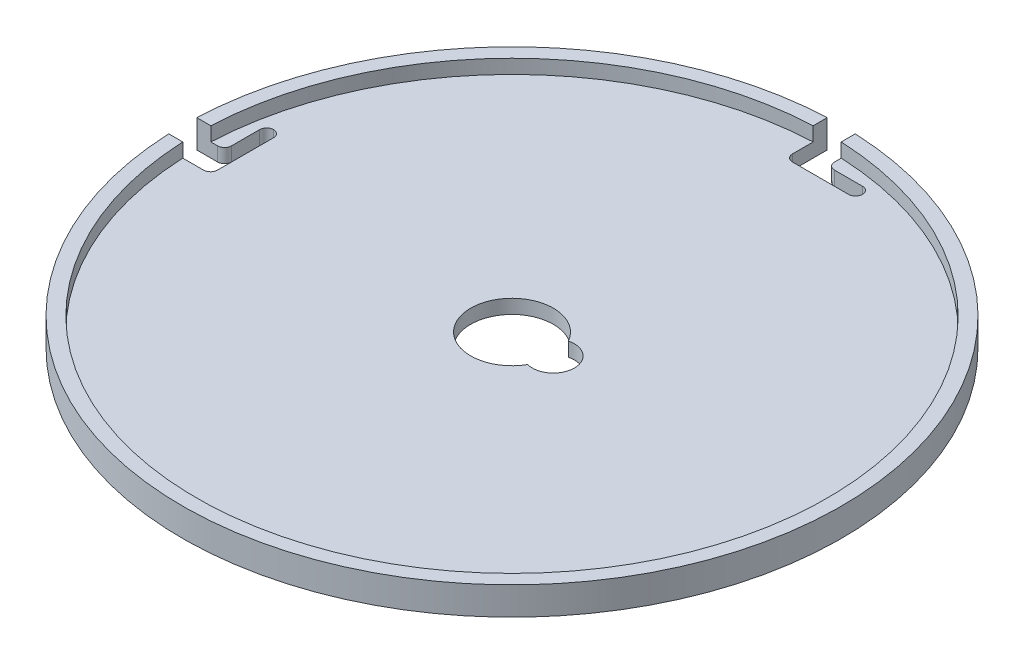
ISO-10303-21;
HEADER;
FILE_DESCRIPTION(('STEP AP214'),'2;1');
FILE_NAME('part.step','',(''),(''),'','','');
FILE_SCHEMA(('AUTOMOTIVE_DESIGN { 1 0 10303 214 1 1 1 1 }'));
ENDSEC;
DATA;
#1=APPLICATION_CONTEXT('core data for automotive mechanical design processes');
#2=APPLICATION_PROTOCOL_DEFINITION('international standard','automotive_design',2000,#1);
#3=PRODUCT_CONTEXT('',#1,'mechanical');
#4=PRODUCT('Part','Part','',(#3));
#5=PRODUCT_RELATED_PRODUCT_CATEGORY('part','',(#4));
#6=PRODUCT_DEFINITION_FORMATION('','',#4);
#7=PRODUCT_DEFINITION_CONTEXT('part definition',#1,'design');
#8=PRODUCT_DEFINITION('design','',#6,#7);
#9=PRODUCT_DEFINITION_SHAPE('','',#8);
#10=(LENGTH_UNIT() NAMED_UNIT(*) SI_UNIT(.MILLI.,.METRE.));
#11=(NAMED_UNIT(*) PLANE_ANGLE_UNIT() SI_UNIT($,.RADIAN.));
#12=(NAMED_UNIT(*) SI_UNIT($,.STERADIAN.) SOLID_ANGLE_UNIT());
#13=UNCERTAINTY_MEASURE_WITH_UNIT(LENGTH_MEASURE(1.E-05),#10,'distance_accuracy_value','');
#14=(GEOMETRIC_REPRESENTATION_CONTEXT(3) GLOBAL_UNCERTAINTY_ASSIGNED_CONTEXT((#13)) GLOBAL_UNIT_ASSIGNED_CONTEXT((#10,
#11,#12)) REPRESENTATION_CONTEXT('',''));
#15=CARTESIAN_POINT('',(0.,0.,0.));
#16=DIRECTION('',(0.,0.,1.));
#17=DIRECTION('',(1.,0.,0.));
#18=AXIS2_PLACEMENT_3D('',#15,#16,#17);
#19=CARTESIAN_POINT('',(0.,2.,0.));
#20=DIRECTION('',(0.,-1.,0.));
#21=DIRECTION('',(0.,0.,-1.));
#22=AXIS2_PLACEMENT_3D('',#19,#20,#21);
#23=CYLINDRICAL_SURFACE('',#22,47.);
#24=DIRECTION('',(0.,-1.,0.));
#25=VECTOR('',#24,1.);
#26=CARTESIAN_POINT('',(-46.9574275274956,2.,-1.99999999999984));
#27=LINE('',#26,#25);
#28=CARTESIAN_POINT('',(-46.9574275274956,2.,-1.99999999999984));
#29=VERTEX_POINT('',#28);
#30=CARTESIAN_POINT('',(-46.9574275274956,-2.,-1.99999999999984));
#31=VERTEX_POINT('',#30);
#32=EDGE_CURVE('E263',#29,#31,#27,.T.);
#33=ORIENTED_EDGE('',*,*,#32,.F.);
#34=CARTESIAN_POINT('',(0.,2.,0.));
#35=DIRECTION('',(0.,1.,0.));
#36=DIRECTION('',(0.,0.,1.));
#37=AXIS2_PLACEMENT_3D('',#34,#35,#36);
#38=CIRCLE('',#37,47.);
#39=CARTESIAN_POINT('',(-2.,2.,-46.9574275274956));
#40=VERTEX_POINT('',#39);
#41=EDGE_CURVE('E326',#40,#29,#38,.T.);
#42=ORIENTED_EDGE('',*,*,#41,.F.);
#43=DIRECTION('',(0.,-1.,0.));
#44=VECTOR('',#43,1.);
#45=CARTESIAN_POINT('',(-2.,2.,-46.9574275274956));
#46=LINE('',#45,#44);
#47=CARTESIAN_POINT('',(-2.,-2.,-46.9574275274956));
#48=VERTEX_POINT('',#47);
#49=EDGE_CURVE('E306',#40,#48,#46,.T.);
#50=ORIENTED_EDGE('',*,*,#49,.T.);
#51=CARTESIAN_POINT('',(0.,-2.,0.));
#52=DIRECTION('',(0.,1.,0.));
#53=DIRECTION('',(0.,0.,1.));
#54=AXIS2_PLACEMENT_3D('',#51,#52,#53);
#55=CIRCLE('',#54,47.);
#56=EDGE_CURVE('E321',#48,#31,#55,.T.);
#57=ORIENTED_EDGE('',*,*,#56,.T.);
#58=EDGE_LOOP('',(#33,#42,#50,#57));
#59=FACE_BOUND('',#58,.T.);
#60=ADVANCED_FACE('F45',(#59),#23,.T.);
#61=CARTESIAN_POINT('',(0.,2.,0.));
#62=DIRECTION('',(0.,1.,0.));
#63=DIRECTION('',(0.,0.,1.));
#64=AXIS2_PLACEMENT_3D('',#61,#62,#63);
#65=PLANE('',#64);
#66=ORIENTED_EDGE('',*,*,#41,.T.);
#67=DIRECTION('',(1.,0.,0.));
#68=VECTOR('',#67,1.);
#69=CARTESIAN_POINT('',(-47.,2.,-1.99999999999984));
#70=LINE('',#69,#68);
#71=CARTESIAN_POINT('',(-44.9555335859781,2.,-1.99999999999984));
#72=VERTEX_POINT('',#71);
#73=EDGE_CURVE('E239',#29,#72,#70,.T.);
#74=ORIENTED_EDGE('',*,*,#73,.T.);
#75=CARTESIAN_POINT('',(0.,2.,0.));
#76=DIRECTION('',(0.,1.,0.));
#77=DIRECTION('',(0.,0.,1.));
#78=AXIS2_PLACEMENT_3D('',#75,#76,#77);
#79=CIRCLE('',#78,45.);
#80=CARTESIAN_POINT('',(-2.,2.,-44.9555335859781));
#81=VERTEX_POINT('',#80);
#82=EDGE_CURVE('E311',#81,#72,#79,.T.);
#83=ORIENTED_EDGE('',*,*,#82,.F.);
#84=DIRECTION('',(0.,0.,1.));
#85=VECTOR('',#84,1.);
#86=CARTESIAN_POINT('',(-2.,2.,-47.));
#87=LINE('',#86,#85);
#88=EDGE_CURVE('E273',#40,#81,#87,.T.);
#89=ORIENTED_EDGE('',*,*,#88,.F.);
#90=EDGE_LOOP('',(#66,#74,#83,#89));
#91=FACE_BOUND('',#90,.T.);
#92=ADVANCED_FACE('F513',(#91),#65,.T.);
#93=CARTESIAN_POINT('',(0.,2.,0.));
#94=DIRECTION('',(0.,-1.,0.));
#95=DIRECTION('',(0.,0.,-1.));
#96=AXIS2_PLACEMENT_3D('',#93,#94,#95);
#97=CYLINDRICAL_SURFACE('',#96,45.);
#98=ORIENTED_EDGE('',*,*,#82,.T.);
#99=DIRECTION('',(0.,-1.,0.));
#100=VECTOR('',#99,1.);
#101=CARTESIAN_POINT('',(-44.9555335859781,2.,-1.99999999999984));
#102=LINE('',#101,#100);
#103=CARTESIAN_POINT('',(-44.9555335859781,0.,-1.99999999999984));
#104=VERTEX_POINT('',#103);
#105=EDGE_CURVE('E259',#72,#104,#102,.T.);
#106=ORIENTED_EDGE('',*,*,#105,.T.);
#107=CARTESIAN_POINT('',(0.,0.,0.));
#108=DIRECTION('',(0.,1.,0.));
#109=DIRECTION('',(0.,0.,1.));
#110=AXIS2_PLACEMENT_3D('',#107,#108,#109);
#111=CIRCLE('',#110,45.);
#112=CARTESIAN_POINT('',(-2.,0.,-44.9555335859781));
#113=VERTEX_POINT('',#112);
#114=EDGE_CURVE('E317',#113,#104,#111,.T.);
#115=ORIENTED_EDGE('',*,*,#114,.F.);
#116=DIRECTION('',(0.,-1.,0.));
#117=VECTOR('',#116,1.);
#118=CARTESIAN_POINT('',(-2.,2.,-44.9555335859781));
#119=LINE('',#118,#117);
#120=EDGE_CURVE('E303',#81,#113,#119,.T.);
#121=ORIENTED_EDGE('',*,*,#120,.F.);
#122=EDGE_LOOP('',(#98,#106,#115,#121));
#123=FACE_BOUND('',#122,.T.);
#124=ADVANCED_FACE('F511',(#123),#97,.F.);
#125=CARTESIAN_POINT('',(-46.9574275274956,2.,2.00000000000016));
#126=VERTEX_POINT('',#125);
#127=CARTESIAN_POINT('',(2.,2.,-46.9574275274956));
#128=VERTEX_POINT('',#127);
#129=EDGE_CURVE('E325',#126,#128,#38,.T.);
#130=ORIENTED_EDGE('',*,*,#129,.F.);
#131=DIRECTION('',(0.,-1.,0.));
#132=VECTOR('',#131,1.);
#133=CARTESIAN_POINT('',(-46.9574275274956,2.,2.00000000000016));
#134=LINE('',#133,#132);
#135=CARTESIAN_POINT('',(-46.9574275274956,-2.,2.00000000000016));
#136=VERTEX_POINT('',#135);
#137=EDGE_CURVE('E269',#126,#136,#134,.T.);
#138=ORIENTED_EDGE('',*,*,#137,.T.);
#139=CARTESIAN_POINT('',(2.,-2.,-46.9574275274956));
#140=VERTEX_POINT('',#139);
#141=EDGE_CURVE('E315',#136,#140,#55,.T.);
#142=ORIENTED_EDGE('',*,*,#141,.T.);
#143=DIRECTION('',(0.,-1.,0.));
#144=VECTOR('',#143,1.);
#145=CARTESIAN_POINT('',(2.,2.,-46.9574275274956));
#146=LINE('',#145,#144);
#147=EDGE_CURVE('E299',#128,#140,#146,.T.);
#148=ORIENTED_EDGE('',*,*,#147,.F.);
#149=EDGE_LOOP('',(#130,#138,#142,#148));
#150=FACE_BOUND('',#149,.T.);
#151=ADVANCED_FACE('F474',(#150),#23,.T.);
#152=DIRECTION('',(1.,0.,0.));
#153=VECTOR('',#152,1.);
#154=CARTESIAN_POINT('',(-47.,2.,2.00000000000016));
#155=LINE('',#154,#153);
#156=CARTESIAN_POINT('',(-44.955533585978,2.,2.00000000000016));
#157=VERTEX_POINT('',#156);
#158=EDGE_CURVE('E235',#126,#157,#155,.T.);
#159=ORIENTED_EDGE('',*,*,#158,.F.);
#160=ORIENTED_EDGE('',*,*,#129,.T.);
#161=DIRECTION('',(0.,0.,1.));
#162=VECTOR('',#161,1.);
#163=CARTESIAN_POINT('',(2.,2.,-47.));
#164=LINE('',#163,#162);
#165=CARTESIAN_POINT('',(2.,2.,-44.9555335859781));
#166=VERTEX_POINT('',#165);
#167=EDGE_CURVE('E276',#128,#166,#164,.T.);
#168=ORIENTED_EDGE('',*,*,#167,.T.);
#169=EDGE_CURVE('E316',#157,#166,#79,.T.);
#170=ORIENTED_EDGE('',*,*,#169,.F.);
#171=EDGE_LOOP('',(#159,#160,#168,#170));
#172=FACE_BOUND('',#171,.T.);
#173=ADVANCED_FACE('F469',(#172),#65,.T.);
#174=CARTESIAN_POINT('',(0.,-2.,0.));
#175=DIRECTION('',(0.,1.,0.));
#176=DIRECTION('',(0.,0.,1.));
#177=AXIS2_PLACEMENT_3D('',#174,#175,#176);
#178=PLANE('',#177);
#179=CARTESIAN_POINT('',(5.9,-2.,0.));
#180=DIRECTION('',(0.,1.,0.));
#181=DIRECTION('',(0.,0.,1.));
#182=AXIS2_PLACEMENT_3D('',#179,#180,#181);
#183=CIRCLE('',#182,3.);
#184=CARTESIAN_POINT('',(5.13728813559322,-2.,2.9014256171567));
#185=VERTEX_POINT('',#184);
#186=CARTESIAN_POINT('',(5.13728813559322,-2.,-2.9014256171567));
#187=VERTEX_POINT('',#186);
#188=EDGE_CURVE('E220',#185,#187,#183,.T.);
#189=ORIENTED_EDGE('',*,*,#188,.T.);
#190=CARTESIAN_POINT('',(0.,-2.,0.));
#191=DIRECTION('',(0.,1.,0.));
#192=DIRECTION('',(0.,0.,1.));
#193=AXIS2_PLACEMENT_3D('',#190,#191,#192);
#194=CIRCLE('',#193,5.9);
#195=EDGE_CURVE('E212',#187,#185,#194,.T.);
#196=ORIENTED_EDGE('',*,*,#195,.T.);
#197=EDGE_LOOP('',(#189,#196));
#198=FACE_BOUND('',#197,.T.);
#199=DIRECTION('',(0.,0.,-1.));
#200=VECTOR('',#199,1.);
#201=CARTESIAN_POINT('',(-43.,-2.,-1.99999999999985));
#202=LINE('',#201,#200);
#203=CARTESIAN_POINT('',(-43.,-2.,-2.99999999999985));
#204=VERTEX_POINT('',#203);
#205=CARTESIAN_POINT('',(-43.,-2.,-6.99999999999985));
#206=VERTEX_POINT('',#205);
#207=EDGE_CURVE('E243',#204,#206,#202,.T.);
#208=ORIENTED_EDGE('',*,*,#207,.F.);
#209=CARTESIAN_POINT('',(-44.,-2.,-2.99999999999985));
#210=DIRECTION('',(0.,1.,0.));
#211=DIRECTION('',(0.,0.,1.));
#212=AXIS2_PLACEMENT_3D('',#209,#210,#211);
#213=CIRCLE('',#212,1.);
#214=CARTESIAN_POINT('',(-44.,-2.,-1.99999999999985));
#215=VERTEX_POINT('',#214);
#216=EDGE_CURVE('E396',#204,#215,#213,.F.);
#217=ORIENTED_EDGE('',*,*,#216,.T.);
#218=DIRECTION('',(1.,0.,0.));
#219=VECTOR('',#218,1.);
#220=CARTESIAN_POINT('',(-47.,-2.,-1.99999999999984));
#221=LINE('',#220,#219);
#222=EDGE_CURVE('E255',#31,#215,#221,.T.);
#223=ORIENTED_EDGE('',*,*,#222,.F.);
#224=ORIENTED_EDGE('',*,*,#56,.F.);
#225=DIRECTION('',(0.,0.,1.));
#226=VECTOR('',#225,1.);
#227=CARTESIAN_POINT('',(-2.,-2.,-47.));
#228=LINE('',#227,#226);
#229=CARTESIAN_POINT('',(-2.,-2.,-42.));
#230=VERTEX_POINT('',#229);
#231=EDGE_CURVE('E287',#48,#230,#228,.T.);
#232=ORIENTED_EDGE('',*,*,#231,.T.);
#233=CARTESIAN_POINT('',(-0.999999999999999,-2.,-42.));
#234=DIRECTION('',(0.,1.,0.));
#235=DIRECTION('',(0.,0.,1.));
#236=AXIS2_PLACEMENT_3D('',#233,#234,#235);
#237=CIRCLE('',#236,1.);
#238=CARTESIAN_POINT('',(-0.999999999999999,-2.,-41.));
#239=VERTEX_POINT('',#238);
#240=EDGE_CURVE('E446',#230,#239,#237,.T.);
#241=ORIENTED_EDGE('',*,*,#240,.T.);
#242=DIRECTION('',(1.,0.,0.));
#243=VECTOR('',#242,1.);
#244=CARTESIAN_POINT('',(-2.,-2.,-41.));
#245=LINE('',#244,#243);
#246=CARTESIAN_POINT('',(7.,-2.,-41.));
#247=VERTEX_POINT('',#246);
#248=EDGE_CURVE('E284',#239,#247,#245,.T.);
#249=ORIENTED_EDGE('',*,*,#248,.T.);
#250=CARTESIAN_POINT('',(7.,-2.,-42.));
#251=DIRECTION('',(0.,1.,0.));
#252=DIRECTION('',(0.,0.,1.));
#253=AXIS2_PLACEMENT_3D('',#250,#251,#252);
#254=CIRCLE('',#253,1.);
#255=CARTESIAN_POINT('',(8.,-2.,-42.));
#256=VERTEX_POINT('',#255);
#257=EDGE_CURVE('E62',#247,#256,#254,.T.);
#258=ORIENTED_EDGE('',*,*,#257,.T.);
#259=CARTESIAN_POINT('',(7.,-2.,-42.));
#260=DIRECTION('',(0.,1.,0.));
#261=DIRECTION('',(0.,0.,1.));
#262=AXIS2_PLACEMENT_3D('',#259,#260,#261);
#263=CIRCLE('',#262,1.);
#264=CARTESIAN_POINT('',(7.,-2.,-43.));
#265=VERTEX_POINT('',#264);
#266=EDGE_CURVE('E11',#256,#265,#263,.T.);
#267=ORIENTED_EDGE('',*,*,#266,.T.);
#268=DIRECTION('',(1.,0.,0.));
#269=VECTOR('',#268,1.);
#270=CARTESIAN_POINT('',(2.,-2.,-43.));
#271=LINE('',#270,#269);
#272=CARTESIAN_POINT('',(3.,-2.,-43.));
#273=VERTEX_POINT('',#272);
#274=EDGE_CURVE('E280',#273,#265,#271,.T.);
#275=ORIENTED_EDGE('',*,*,#274,.F.);
#276=CARTESIAN_POINT('',(3.,-2.,-44.));
#277=DIRECTION('',(0.,1.,0.));
#278=DIRECTION('',(0.,0.,1.));
#279=AXIS2_PLACEMENT_3D('',#276,#277,#278);
#280=CIRCLE('',#279,1.);
#281=CARTESIAN_POINT('',(2.,-2.,-44.));
#282=VERTEX_POINT('',#281);
#283=EDGE_CURVE('E393',#273,#282,#280,.F.);
#284=ORIENTED_EDGE('',*,*,#283,.T.);
#285=DIRECTION('',(0.,0.,1.));
#286=VECTOR('',#285,1.);
#287=CARTESIAN_POINT('',(2.,-2.,-47.));
#288=LINE('',#287,#286);
#289=EDGE_CURVE('E291',#140,#282,#288,.T.);
#290=ORIENTED_EDGE('',*,*,#289,.F.);
#291=ORIENTED_EDGE('',*,*,#141,.F.);
#292=DIRECTION('',(1.,0.,0.));
#293=VECTOR('',#292,1.);
#294=CARTESIAN_POINT('',(-47.,-2.,2.00000000000016));
#295=LINE('',#294,#293);
#296=CARTESIAN_POINT('',(-42.,-2.,2.00000000000015));
#297=VERTEX_POINT('',#296);
#298=EDGE_CURVE('E251',#136,#297,#295,.T.);
#299=ORIENTED_EDGE('',*,*,#298,.T.);
#300=CARTESIAN_POINT('',(-42.,-2.,1.00000000000015));
#301=DIRECTION('',(0.,1.,0.));
#302=DIRECTION('',(0.,0.,1.));
#303=AXIS2_PLACEMENT_3D('',#300,#301,#302);
#304=CIRCLE('',#303,1.);
#305=CARTESIAN_POINT('',(-41.,-2.,1.00000000000014));
#306=VERTEX_POINT('',#305);
#307=EDGE_CURVE('E423',#297,#306,#304,.T.);
#308=ORIENTED_EDGE('',*,*,#307,.T.);
#309=DIRECTION('',(0.,0.,-1.));
#310=VECTOR('',#309,1.);
#311=CARTESIAN_POINT('',(-41.,-2.,2.00000000000014));
#312=LINE('',#311,#310);
#313=CARTESIAN_POINT('',(-41.,-2.,-6.99999999999986));
#314=VERTEX_POINT('',#313);
#315=EDGE_CURVE('E247',#306,#314,#312,.T.);
#316=ORIENTED_EDGE('',*,*,#315,.T.);
#317=CARTESIAN_POINT('',(-42.,-2.,-6.99999999999985));
#318=DIRECTION('',(0.,1.,0.));
#319=DIRECTION('',(0.,0.,1.));
#320=AXIS2_PLACEMENT_3D('',#317,#318,#319);
#321=CIRCLE('',#320,1.);
#322=CARTESIAN_POINT('',(-42.,-2.,-7.99999999999985));
#323=VERTEX_POINT('',#322);
#324=EDGE_CURVE('E429',#314,#323,#321,.T.);
#325=ORIENTED_EDGE('',*,*,#324,.T.);
#326=CARTESIAN_POINT('',(-42.,-2.,-6.99999999999985));
#327=DIRECTION('',(0.,1.,0.));
#328=DIRECTION('',(0.,0.,1.));
#329=AXIS2_PLACEMENT_3D('',#326,#327,#328);
#330=CIRCLE('',#329,1.);
#331=EDGE_CURVE('E435',#323,#206,#330,.T.);
#332=ORIENTED_EDGE('',*,*,#331,.T.);
#333=EDGE_LOOP('',(#208,#217,#223,#224,#232,#241,#249,#258,#267,#275,#284,#290,#291,#299,#308,
#316,#325,#332));
#334=FACE_BOUND('',#333,.T.);
#335=ADVANCED_FACE('F227',(#198,#334),#178,.F.);
#336=DIRECTION('',(0.,-1.,0.));
#337=VECTOR('',#336,1.);
#338=CARTESIAN_POINT('',(-44.955533585978,2.,2.00000000000016));
#339=LINE('',#338,#337);
#340=CARTESIAN_POINT('',(-44.955533585978,0.,2.00000000000016));
#341=VERTEX_POINT('',#340);
#342=EDGE_CURVE('E266',#157,#341,#339,.T.);
#343=ORIENTED_EDGE('',*,*,#342,.F.);
#344=ORIENTED_EDGE('',*,*,#169,.T.);
#345=DIRECTION('',(0.,-1.,0.));
#346=VECTOR('',#345,1.);
#347=CARTESIAN_POINT('',(2.,2.,-44.9555335859781));
#348=LINE('',#347,#346);
#349=CARTESIAN_POINT('',(2.,0.,-44.9555335859781));
#350=VERTEX_POINT('',#349);
#351=EDGE_CURVE('E295',#166,#350,#348,.T.);
#352=ORIENTED_EDGE('',*,*,#351,.T.);
#353=EDGE_CURVE('E310',#341,#350,#111,.T.);
#354=ORIENTED_EDGE('',*,*,#353,.F.);
#355=EDGE_LOOP('',(#343,#344,#352,#354));
#356=FACE_BOUND('',#355,.T.);
#357=ADVANCED_FACE('F465',(#356),#97,.F.);
#358=CARTESIAN_POINT('',(0.,0.,0.));
#359=DIRECTION('',(0.,1.,0.));
#360=DIRECTION('',(0.,0.,1.));
#361=AXIS2_PLACEMENT_3D('',#358,#359,#360);
#362=PLANE('',#361);
#363=CARTESIAN_POINT('',(0.,0.,0.));
#364=DIRECTION('',(0.,1.,0.));
#365=DIRECTION('',(0.,0.,1.));
#366=AXIS2_PLACEMENT_3D('',#363,#364,#365);
#367=CIRCLE('',#366,5.9);
#368=CARTESIAN_POINT('',(5.13728813559322,0.,-2.9014256171567));
#369=VERTEX_POINT('',#368);
#370=CARTESIAN_POINT('',(5.13728813559322,0.,2.9014256171567));
#371=VERTEX_POINT('',#370);
#372=EDGE_CURVE('E215',#369,#371,#367,.T.);
#373=ORIENTED_EDGE('',*,*,#372,.F.);
#374=CARTESIAN_POINT('',(5.9,0.,0.));
#375=DIRECTION('',(0.,1.,0.));
#376=DIRECTION('',(0.,0.,1.));
#377=AXIS2_PLACEMENT_3D('',#374,#375,#376);
#378=CIRCLE('',#377,3.);
#379=EDGE_CURVE('E361',#371,#369,#378,.T.);
#380=ORIENTED_EDGE('',*,*,#379,.F.);
#381=EDGE_LOOP('',(#373,#380));
#382=FACE_BOUND('',#381,.T.);
#383=DIRECTION('',(1.,0.,0.));
#384=VECTOR('',#383,1.);
#385=CARTESIAN_POINT('',(0.,0.,-2.00000000000001));
#386=LINE('',#385,#384);
#387=CARTESIAN_POINT('',(-44.,0.,-1.99999999999985));
#388=VERTEX_POINT('',#387);
#389=EDGE_CURVE('E345',#104,#388,#386,.T.);
#390=ORIENTED_EDGE('',*,*,#389,.T.);
#391=CARTESIAN_POINT('',(-44.,0.,-2.99999999999985));
#392=DIRECTION('',(0.,1.,0.));
#393=DIRECTION('',(0.,0.,1.));
#394=AXIS2_PLACEMENT_3D('',#391,#392,#393);
#395=CIRCLE('',#394,1.);
#396=CARTESIAN_POINT('',(-43.,0.,-2.99999999999985));
#397=VERTEX_POINT('',#396);
#398=EDGE_CURVE('E390',#388,#397,#395,.T.);
#399=ORIENTED_EDGE('',*,*,#398,.T.);
#400=DIRECTION('',(0.,0.,-1.));
#401=VECTOR('',#400,1.);
#402=CARTESIAN_POINT('',(-43.,0.,1.50133697570255E-13));
#403=LINE('',#402,#401);
#404=CARTESIAN_POINT('',(-43.,0.,-6.99999999999985));
#405=VERTEX_POINT('',#404);
#406=EDGE_CURVE('E349',#397,#405,#403,.T.);
#407=ORIENTED_EDGE('',*,*,#406,.T.);
#408=CARTESIAN_POINT('',(-42.,0.,-6.99999999999985));
#409=DIRECTION('',(0.,1.,0.));
#410=DIRECTION('',(0.,0.,1.));
#411=AXIS2_PLACEMENT_3D('',#408,#409,#410);
#412=CIRCLE('',#411,1.);
#413=CARTESIAN_POINT('',(-42.,0.,-7.99999999999985));
#414=VERTEX_POINT('',#413);
#415=EDGE_CURVE('E432',#405,#414,#412,.F.);
#416=ORIENTED_EDGE('',*,*,#415,.T.);
#417=CARTESIAN_POINT('',(-42.,0.,-6.99999999999985));
#418=DIRECTION('',(0.,1.,0.));
#419=DIRECTION('',(0.,0.,1.));
#420=AXIS2_PLACEMENT_3D('',#417,#418,#419);
#421=CIRCLE('',#420,1.);
#422=CARTESIAN_POINT('',(-41.,0.,-6.99999999999986));
#423=VERTEX_POINT('',#422);
#424=EDGE_CURVE('E426',#414,#423,#421,.F.);
#425=ORIENTED_EDGE('',*,*,#424,.T.);
#426=DIRECTION('',(0.,0.,-1.));
#427=VECTOR('',#426,1.);
#428=CARTESIAN_POINT('',(-41.,0.,1.43150734892569E-13));
#429=LINE('',#428,#427);
#430=CARTESIAN_POINT('',(-41.,0.,1.00000000000014));
#431=VERTEX_POINT('',#430);
#432=EDGE_CURVE('E353',#431,#423,#429,.T.);
#433=ORIENTED_EDGE('',*,*,#432,.F.);
#434=CARTESIAN_POINT('',(-42.,0.,1.00000000000015));
#435=DIRECTION('',(0.,1.,0.));
#436=DIRECTION('',(0.,0.,1.));
#437=AXIS2_PLACEMENT_3D('',#434,#435,#436);
#438=CIRCLE('',#437,1.);
#439=CARTESIAN_POINT('',(-42.,0.,2.00000000000015));
#440=VERTEX_POINT('',#439);
#441=EDGE_CURVE('E420',#431,#440,#438,.F.);
#442=ORIENTED_EDGE('',*,*,#441,.T.);
#443=DIRECTION('',(1.,0.,0.));
#444=VECTOR('',#443,1.);
#445=CARTESIAN_POINT('',(0.,0.,1.99999999999999));
#446=LINE('',#445,#444);
#447=EDGE_CURVE('E357',#341,#440,#446,.T.);
#448=ORIENTED_EDGE('',*,*,#447,.F.);
#449=ORIENTED_EDGE('',*,*,#353,.T.);
#450=DIRECTION('',(0.,0.,1.));
#451=VECTOR('',#450,1.);
#452=CARTESIAN_POINT('',(2.00000000000001,0.,0.));
#453=LINE('',#452,#451);
#454=CARTESIAN_POINT('',(2.,0.,-44.));
#455=VERTEX_POINT('',#454);
#456=EDGE_CURVE('E330',#350,#455,#453,.T.);
#457=ORIENTED_EDGE('',*,*,#456,.T.);
#458=CARTESIAN_POINT('',(3.,0.,-44.));
#459=DIRECTION('',(0.,1.,0.));
#460=DIRECTION('',(0.,0.,1.));
#461=AXIS2_PLACEMENT_3D('',#458,#459,#460);
#462=CIRCLE('',#461,1.);
#463=CARTESIAN_POINT('',(3.,0.,-43.));
#464=VERTEX_POINT('',#463);
#465=EDGE_CURVE('E387',#455,#464,#462,.T.);
#466=ORIENTED_EDGE('',*,*,#465,.T.);
#467=DIRECTION('',(1.,0.,0.));
#468=VECTOR('',#467,1.);
#469=CARTESIAN_POINT('',(0.,0.,-43.));
#470=LINE('',#469,#468);
#471=CARTESIAN_POINT('',(7.,0.,-43.));
#472=VERTEX_POINT('',#471);
#473=EDGE_CURVE('E334',#464,#472,#470,.T.);
#474=ORIENTED_EDGE('',*,*,#473,.T.);
#475=CARTESIAN_POINT('',(7.,0.,-42.));
#476=DIRECTION('',(0.,1.,0.));
#477=DIRECTION('',(0.,0.,1.));
#478=AXIS2_PLACEMENT_3D('',#475,#476,#477);
#479=CIRCLE('',#478,1.);
#480=CARTESIAN_POINT('',(8.,0.,-42.));
#481=VERTEX_POINT('',#480);
#482=EDGE_CURVE('E55',#472,#481,#479,.F.);
#483=ORIENTED_EDGE('',*,*,#482,.T.);
#484=CARTESIAN_POINT('',(7.,0.,-42.));
#485=DIRECTION('',(0.,1.,0.));
#486=DIRECTION('',(0.,0.,1.));
#487=AXIS2_PLACEMENT_3D('',#484,#485,#486);
#488=CIRCLE('',#487,1.);
#489=CARTESIAN_POINT('',(7.,0.,-41.));
#490=VERTEX_POINT('',#489);
#491=EDGE_CURVE('E438',#481,#490,#488,.F.);
#492=ORIENTED_EDGE('',*,*,#491,.T.);
#493=DIRECTION('',(1.,0.,0.));
#494=VECTOR('',#493,1.);
#495=CARTESIAN_POINT('',(0.,0.,-41.));
#496=LINE('',#495,#494);
#497=CARTESIAN_POINT('',(-0.999999999999999,0.,-41.));
#498=VERTEX_POINT('',#497);
#499=EDGE_CURVE('E337',#498,#490,#496,.T.);
#500=ORIENTED_EDGE('',*,*,#499,.F.);
#501=CARTESIAN_POINT('',(-0.999999999999999,0.,-42.));
#502=DIRECTION('',(0.,1.,0.));
#503=DIRECTION('',(0.,0.,1.));
#504=AXIS2_PLACEMENT_3D('',#501,#502,#503);
#505=CIRCLE('',#504,1.);
#506=CARTESIAN_POINT('',(-2.,0.,-42.));
#507=VERTEX_POINT('',#506);
#508=EDGE_CURVE('E443',#498,#507,#505,.F.);
#509=ORIENTED_EDGE('',*,*,#508,.T.);
#510=DIRECTION('',(0.,0.,1.));
#511=VECTOR('',#510,1.);
#512=CARTESIAN_POINT('',(-1.99999999999999,0.,0.));
#513=LINE('',#512,#511);
#514=EDGE_CURVE('E341',#113,#507,#513,.T.);
#515=ORIENTED_EDGE('',*,*,#514,.F.);
#516=ORIENTED_EDGE('',*,*,#114,.T.);
#517=EDGE_LOOP('',(#390,#399,#407,#416,#425,#433,#442,#448,#449,#457,#466,#474,#483,#492,#500,
#509,#515,#516));
#518=FACE_BOUND('',#517,.T.);
#519=ADVANCED_FACE('F457',(#382,#518),#362,.T.);
#520=CARTESIAN_POINT('',(-2.,-2.,-47.));
#521=DIRECTION('',(-1.,0.,0.));
#522=DIRECTION('',(0.,0.,1.));
#523=AXIS2_PLACEMENT_3D('',#520,#521,#522);
#524=PLANE('',#523);
#525=ORIENTED_EDGE('',*,*,#514,.T.);
#526=DIRECTION('',(0.,1.,0.));
#527=VECTOR('',#526,1.);
#528=CARTESIAN_POINT('',(-2.,-2.,-42.));
#529=LINE('',#528,#527);
#530=EDGE_CURVE('E407',#507,#230,#529,.F.);
#531=ORIENTED_EDGE('',*,*,#530,.T.);
#532=ORIENTED_EDGE('',*,*,#231,.F.);
#533=ORIENTED_EDGE('',*,*,#49,.F.);
#534=ORIENTED_EDGE('',*,*,#88,.T.);
#535=ORIENTED_EDGE('',*,*,#120,.T.);
#536=EDGE_LOOP('',(#525,#531,#532,#533,#534,#535));
#537=FACE_BOUND('',#536,.T.);
#538=ADVANCED_FACE('F506',(#537),#524,.F.);
#539=CARTESIAN_POINT('',(2.,-2.,-47.));
#540=DIRECTION('',(-1.,0.,0.));
#541=DIRECTION('',(0.,0.,1.));
#542=AXIS2_PLACEMENT_3D('',#539,#540,#541);
#543=PLANE('',#542);
#544=ORIENTED_EDGE('',*,*,#289,.T.);
#545=DIRECTION('',(0.,1.,0.));
#546=VECTOR('',#545,1.);
#547=CARTESIAN_POINT('',(2.,-2.,-44.));
#548=LINE('',#547,#546);
#549=EDGE_CURVE('E416',#282,#455,#548,.T.);
#550=ORIENTED_EDGE('',*,*,#549,.T.);
#551=ORIENTED_EDGE('',*,*,#456,.F.);
#552=ORIENTED_EDGE('',*,*,#351,.F.);
#553=ORIENTED_EDGE('',*,*,#167,.F.);
#554=ORIENTED_EDGE('',*,*,#147,.T.);
#555=EDGE_LOOP('',(#544,#550,#551,#552,#553,#554));
#556=FACE_BOUND('',#555,.T.);
#557=ADVANCED_FACE('F462',(#556),#543,.T.);
#558=CARTESIAN_POINT('',(2.,-2.,-43.));
#559=DIRECTION('',(0.,0.,1.));
#560=DIRECTION('',(1.,0.,0.));
#561=AXIS2_PLACEMENT_3D('',#558,#559,#560);
#562=PLANE('',#561);
#563=ORIENTED_EDGE('',*,*,#274,.T.);
#564=DIRECTION('',(0.,1.,0.));
#565=VECTOR('',#564,1.);
#566=CARTESIAN_POINT('',(7.,-2.,-43.));
#567=LINE('',#566,#565);
#568=EDGE_CURVE('E413',#265,#472,#567,.T.);
#569=ORIENTED_EDGE('',*,*,#568,.T.);
#570=ORIENTED_EDGE('',*,*,#473,.F.);
#571=DIRECTION('',(0.,1.,0.));
#572=VECTOR('',#571,1.);
#573=CARTESIAN_POINT('',(3.,-2.,-43.));
#574=LINE('',#573,#572);
#575=EDGE_CURVE('E410',#464,#273,#574,.F.);
#576=ORIENTED_EDGE('',*,*,#575,.T.);
#577=EDGE_LOOP('',(#563,#569,#570,#576));
#578=FACE_BOUND('',#577,.T.);
#579=ADVANCED_FACE('F484',(#578),#562,.T.);
#580=CARTESIAN_POINT('',(-2.,-2.,-41.));
#581=DIRECTION('',(0.,0.,1.));
#582=DIRECTION('',(1.,0.,0.));
#583=AXIS2_PLACEMENT_3D('',#580,#581,#582);
#584=PLANE('',#583);
#585=ORIENTED_EDGE('',*,*,#499,.T.);
#586=DIRECTION('',(0.,1.,0.));
#587=VECTOR('',#586,1.);
#588=CARTESIAN_POINT('',(7.,-2.,-41.));
#589=LINE('',#588,#587);
#590=EDGE_CURVE('E403',#490,#247,#589,.F.);
#591=ORIENTED_EDGE('',*,*,#590,.T.);
#592=ORIENTED_EDGE('',*,*,#248,.F.);
#593=DIRECTION('',(0.,1.,0.));
#594=VECTOR('',#593,1.);
#595=CARTESIAN_POINT('',(-0.999999999999999,0.,-41.));
#596=LINE('',#595,#594);
#597=EDGE_CURVE('E399',#239,#498,#596,.T.);
#598=ORIENTED_EDGE('',*,*,#597,.T.);
#599=EDGE_LOOP('',(#585,#591,#592,#598));
#600=FACE_BOUND('',#599,.T.);
#601=ADVANCED_FACE('F496',(#600),#584,.F.);
#602=CARTESIAN_POINT('',(-47.,-2.,2.00000000000016));
#603=DIRECTION('',(0.,0.,1.));
#604=DIRECTION('',(1.,0.,0.));
#605=AXIS2_PLACEMENT_3D('',#602,#603,#604);
#606=PLANE('',#605);
#607=ORIENTED_EDGE('',*,*,#447,.T.);
#608=DIRECTION('',(0.,1.,0.));
#609=VECTOR('',#608,1.);
#610=CARTESIAN_POINT('',(-42.,-2.,2.00000000000015));
#611=LINE('',#610,#609);
#612=EDGE_CURVE('E374',#440,#297,#611,.F.);
#613=ORIENTED_EDGE('',*,*,#612,.T.);
#614=ORIENTED_EDGE('',*,*,#298,.F.);
#615=ORIENTED_EDGE('',*,*,#137,.F.);
#616=ORIENTED_EDGE('',*,*,#158,.T.);
#617=ORIENTED_EDGE('',*,*,#342,.T.);
#618=EDGE_LOOP('',(#607,#613,#614,#615,#616,#617));
#619=FACE_BOUND('',#618,.T.);
#620=ADVANCED_FACE('F548',(#619),#606,.F.);
#621=CARTESIAN_POINT('',(-47.,-2.,-1.99999999999984));
#622=DIRECTION('',(0.,0.,1.));
#623=DIRECTION('',(1.,0.,0.));
#624=AXIS2_PLACEMENT_3D('',#621,#622,#623);
#625=PLANE('',#624);
#626=ORIENTED_EDGE('',*,*,#222,.T.);
#627=DIRECTION('',(0.,1.,0.));
#628=VECTOR('',#627,1.);
#629=CARTESIAN_POINT('',(-44.,-2.,-1.99999999999985));
#630=LINE('',#629,#628);
#631=EDGE_CURVE('E383',#215,#388,#630,.T.);
#632=ORIENTED_EDGE('',*,*,#631,.T.);
#633=ORIENTED_EDGE('',*,*,#389,.F.);
#634=ORIENTED_EDGE('',*,*,#105,.F.);
#635=ORIENTED_EDGE('',*,*,#73,.F.);
#636=ORIENTED_EDGE('',*,*,#32,.T.);
#637=EDGE_LOOP('',(#626,#632,#633,#634,#635,#636));
#638=FACE_BOUND('',#637,.T.);
#639=ADVANCED_FACE('F517',(#638),#625,.T.);
#640=CARTESIAN_POINT('',(-43.,-2.,-1.99999999999985));
#641=DIRECTION('',(1.,0.,0.));
#642=DIRECTION('',(0.,0.,-1.));
#643=AXIS2_PLACEMENT_3D('',#640,#641,#642);
#644=PLANE('',#643);
#645=ORIENTED_EDGE('',*,*,#207,.T.);
#646=DIRECTION('',(0.,1.,0.));
#647=VECTOR('',#646,1.);
#648=CARTESIAN_POINT('',(-43.,-2.,-6.99999999999985));
#649=LINE('',#648,#647);
#650=EDGE_CURVE('E380',#206,#405,#649,.T.);
#651=ORIENTED_EDGE('',*,*,#650,.T.);
#652=ORIENTED_EDGE('',*,*,#406,.F.);
#653=DIRECTION('',(0.,1.,0.));
#654=VECTOR('',#653,1.);
#655=CARTESIAN_POINT('',(-43.,-2.,-2.99999999999985));
#656=LINE('',#655,#654);
#657=EDGE_CURVE('E377',#397,#204,#656,.F.);
#658=ORIENTED_EDGE('',*,*,#657,.T.);
#659=EDGE_LOOP('',(#645,#651,#652,#658));
#660=FACE_BOUND('',#659,.T.);
#661=ADVANCED_FACE('F529',(#660),#644,.T.);
#662=CARTESIAN_POINT('',(-41.,-2.,2.00000000000014));
#663=DIRECTION('',(1.,0.,0.));
#664=DIRECTION('',(0.,0.,-1.));
#665=AXIS2_PLACEMENT_3D('',#662,#663,#664);
#666=PLANE('',#665);
#667=ORIENTED_EDGE('',*,*,#315,.F.);
#668=DIRECTION('',(0.,1.,0.));
#669=VECTOR('',#668,1.);
#670=CARTESIAN_POINT('',(-41.,0.,1.00000000000014));
#671=LINE('',#670,#669);
#672=EDGE_CURVE('E370',#306,#431,#671,.T.);
#673=ORIENTED_EDGE('',*,*,#672,.T.);
#674=ORIENTED_EDGE('',*,*,#432,.T.);
#675=DIRECTION('',(0.,1.,0.));
#676=VECTOR('',#675,1.);
#677=CARTESIAN_POINT('',(-41.,-2.,-6.99999999999986));
#678=LINE('',#677,#676);
#679=EDGE_CURVE('E366',#423,#314,#678,.F.);
#680=ORIENTED_EDGE('',*,*,#679,.T.);
#681=EDGE_LOOP('',(#667,#673,#674,#680));
#682=FACE_BOUND('',#681,.T.);
#683=ADVANCED_FACE('F541',(#682),#666,.F.);
#684=CARTESIAN_POINT('',(0.,-2.,0.));
#685=DIRECTION('',(0.,1.,0.));
#686=DIRECTION('',(0.,0.,1.));
#687=AXIS2_PLACEMENT_3D('',#684,#685,#686);
#688=CYLINDRICAL_SURFACE('',#687,5.9);
#689=ORIENTED_EDGE('',*,*,#372,.T.);
#690=DIRECTION('',(0.,1.,0.));
#691=VECTOR('',#690,1.);
#692=CARTESIAN_POINT('',(5.13728813559322,-2.,2.9014256171567));
#693=LINE('',#692,#691);
#694=EDGE_CURVE('E207',#185,#371,#693,.T.);
#695=ORIENTED_EDGE('',*,*,#694,.F.);
#696=ORIENTED_EDGE('',*,*,#195,.F.);
#697=DIRECTION('',(0.,1.,0.));
#698=VECTOR('',#697,1.);
#699=CARTESIAN_POINT('',(5.13728813559322,-2.,-2.9014256171567));
#700=LINE('',#699,#698);
#701=EDGE_CURVE('E219',#187,#369,#700,.T.);
#702=ORIENTED_EDGE('',*,*,#701,.T.);
#703=EDGE_LOOP('',(#689,#695,#696,#702));
#704=FACE_BOUND('',#703,.T.);
#705=ADVANCED_FACE('F209',(#704),#688,.F.);
#706=CARTESIAN_POINT('',(5.9,-2.,0.));
#707=DIRECTION('',(0.,1.,0.));
#708=DIRECTION('',(0.,0.,1.));
#709=AXIS2_PLACEMENT_3D('',#706,#707,#708);
#710=CYLINDRICAL_SURFACE('',#709,3.);
#711=ORIENTED_EDGE('',*,*,#379,.T.);
#712=ORIENTED_EDGE('',*,*,#701,.F.);
#713=ORIENTED_EDGE('',*,*,#188,.F.);
#714=ORIENTED_EDGE('',*,*,#694,.T.);
#715=EDGE_LOOP('',(#711,#712,#713,#714));
#716=FACE_BOUND('',#715,.T.);
#717=ADVANCED_FACE('F223',(#716),#710,.F.);
#718=CARTESIAN_POINT('',(-42.,-2.,1.00000000000015));
#719=DIRECTION('',(0.,-1.,0.));
#720=DIRECTION('',(0.,0.,-1.));
#721=AXIS2_PLACEMENT_3D('',#718,#719,#720);
#722=CYLINDRICAL_SURFACE('',#721,1.);
#723=ORIENTED_EDGE('',*,*,#307,.F.);
#724=ORIENTED_EDGE('',*,*,#612,.F.);
#725=ORIENTED_EDGE('',*,*,#441,.F.);
#726=ORIENTED_EDGE('',*,*,#672,.F.);
#727=EDGE_LOOP('',(#723,#724,#725,#726));
#728=FACE_BOUND('',#727,.T.);
#729=ADVANCED_FACE('F545',(#728),#722,.F.);
#730=CARTESIAN_POINT('',(-42.,-2.,-6.99999999999985));
#731=DIRECTION('',(0.,1.,0.));
#732=DIRECTION('',(0.,0.,1.));
#733=AXIS2_PLACEMENT_3D('',#730,#731,#732);
#734=CYLINDRICAL_SURFACE('',#733,1.);
#735=ORIENTED_EDGE('',*,*,#650,.F.);
#736=ORIENTED_EDGE('',*,*,#331,.F.);
#737=DIRECTION('',(0.,1.,0.));
#738=VECTOR('',#737,1.);
#739=CARTESIAN_POINT('',(-42.,-2.,-7.99999999999985));
#740=LINE('',#739,#738);
#741=EDGE_CURVE('E229',#414,#323,#740,.F.);
#742=ORIENTED_EDGE('',*,*,#741,.F.);
#743=ORIENTED_EDGE('',*,*,#415,.F.);
#744=EDGE_LOOP('',(#735,#736,#742,#743));
#745=FACE_BOUND('',#744,.T.);
#746=ADVANCED_FACE('F533',(#745),#734,.F.);
#747=CARTESIAN_POINT('',(-42.,-2.,-6.99999999999985));
#748=DIRECTION('',(0.,-1.,0.));
#749=DIRECTION('',(0.,0.,-1.));
#750=AXIS2_PLACEMENT_3D('',#747,#748,#749);
#751=CYLINDRICAL_SURFACE('',#750,1.);
#752=ORIENTED_EDGE('',*,*,#324,.F.);
#753=ORIENTED_EDGE('',*,*,#679,.F.);
#754=ORIENTED_EDGE('',*,*,#424,.F.);
#755=ORIENTED_EDGE('',*,*,#741,.T.);
#756=EDGE_LOOP('',(#752,#753,#754,#755));
#757=FACE_BOUND('',#756,.T.);
#758=ADVANCED_FACE('F543',(#757),#751,.F.);
#759=CARTESIAN_POINT('',(-44.,-2.,-2.99999999999985));
#760=DIRECTION('',(0.,1.,0.));
#761=DIRECTION('',(0.,0.,1.));
#762=AXIS2_PLACEMENT_3D('',#759,#760,#761);
#763=CYLINDRICAL_SURFACE('',#762,1.);
#764=ORIENTED_EDGE('',*,*,#216,.F.);
#765=ORIENTED_EDGE('',*,*,#657,.F.);
#766=ORIENTED_EDGE('',*,*,#398,.F.);
#767=ORIENTED_EDGE('',*,*,#631,.F.);
#768=EDGE_LOOP('',(#764,#765,#766,#767));
#769=FACE_BOUND('',#768,.T.);
#770=ADVANCED_FACE('F524',(#769),#763,.T.);
#771=CARTESIAN_POINT('',(7.,-2.,-42.));
#772=DIRECTION('',(0.,1.,0.));
#773=DIRECTION('',(0.,0.,1.));
#774=AXIS2_PLACEMENT_3D('',#771,#772,#773);
#775=CYLINDRICAL_SURFACE('',#774,1.);
#776=ORIENTED_EDGE('',*,*,#568,.F.);
#777=ORIENTED_EDGE('',*,*,#266,.F.);
#778=DIRECTION('',(0.,1.,0.));
#779=VECTOR('',#778,1.);
#780=CARTESIAN_POINT('',(8.,-2.,-42.));
#781=LINE('',#780,#779);
#782=EDGE_CURVE('E49',#481,#256,#781,.F.);
#783=ORIENTED_EDGE('',*,*,#782,.F.);
#784=ORIENTED_EDGE('',*,*,#482,.F.);
#785=EDGE_LOOP('',(#776,#777,#783,#784));
#786=FACE_BOUND('',#785,.T.);
#787=ADVANCED_FACE('F487',(#786),#775,.F.);
#788=CARTESIAN_POINT('',(7.,-2.,-42.));
#789=DIRECTION('',(0.,-1.,0.));
#790=DIRECTION('',(0.,0.,-1.));
#791=AXIS2_PLACEMENT_3D('',#788,#789,#790);
#792=CYLINDRICAL_SURFACE('',#791,1.);
#793=ORIENTED_EDGE('',*,*,#257,.F.);
#794=ORIENTED_EDGE('',*,*,#590,.F.);
#795=ORIENTED_EDGE('',*,*,#491,.F.);
#796=ORIENTED_EDGE('',*,*,#782,.T.);
#797=EDGE_LOOP('',(#793,#794,#795,#796));
#798=FACE_BOUND('',#797,.T.);
#799=ADVANCED_FACE('F493',(#798),#792,.F.);
#800=CARTESIAN_POINT('',(-0.999999999999999,-2.,-42.));
#801=DIRECTION('',(0.,-1.,0.));
#802=DIRECTION('',(0.,0.,-1.));
#803=AXIS2_PLACEMENT_3D('',#800,#801,#802);
#804=CYLINDRICAL_SURFACE('',#803,1.);
#805=ORIENTED_EDGE('',*,*,#240,.F.);
#806=ORIENTED_EDGE('',*,*,#530,.F.);
#807=ORIENTED_EDGE('',*,*,#508,.F.);
#808=ORIENTED_EDGE('',*,*,#597,.F.);
#809=EDGE_LOOP('',(#805,#806,#807,#808));
#810=FACE_BOUND('',#809,.T.);
#811=ADVANCED_FACE('F501',(#810),#804,.F.);
#812=CARTESIAN_POINT('',(3.,-2.,-44.));
#813=DIRECTION('',(0.,1.,0.));
#814=DIRECTION('',(0.,0.,1.));
#815=AXIS2_PLACEMENT_3D('',#812,#813,#814);
#816=CYLINDRICAL_SURFACE('',#815,1.);
#817=ORIENTED_EDGE('',*,*,#283,.F.);
#818=ORIENTED_EDGE('',*,*,#575,.F.);
#819=ORIENTED_EDGE('',*,*,#465,.F.);
#820=ORIENTED_EDGE('',*,*,#549,.F.);
#821=EDGE_LOOP('',(#817,#818,#819,#820));
#822=FACE_BOUND('',#821,.T.);
#823=ADVANCED_FACE('F47',(#822),#816,.T.);
#824=CLOSED_SHELL('',(#60,#92,#124,#151,#173,#335,#357,#519,#538,#557,#579,#601,#620,#639,#661,
#683,#705,#717,#729,#746,#758,#770,#787,#799,#811,#823));
#825=MANIFOLD_SOLID_BREP('B2',#824);
#826=ADVANCED_BREP_SHAPE_REPRESENTATION('',(#18,#825),#14);
#827=SHAPE_DEFINITION_REPRESENTATION(#9,#826);
ENDSEC;
END-ISO-10303-21;
